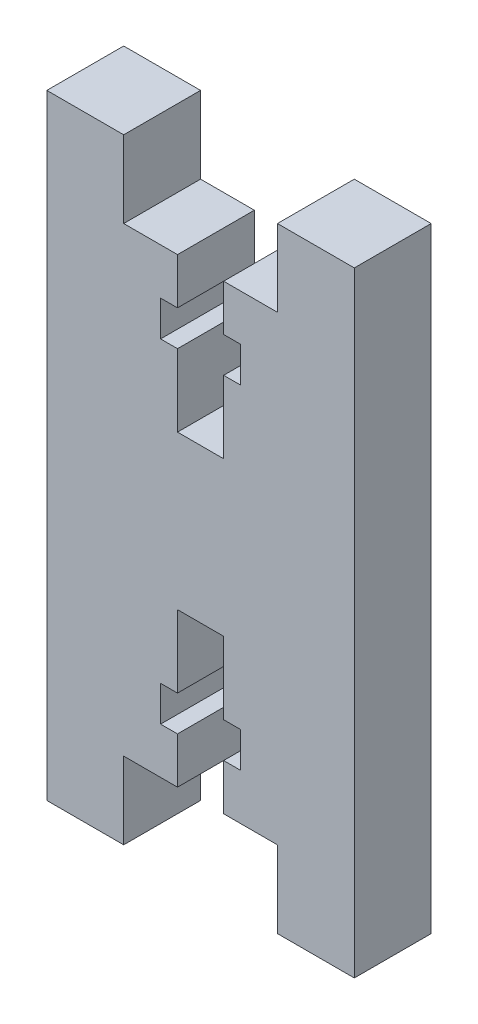
ISO-10303-21;
HEADER;
FILE_DESCRIPTION(('STEP AP214'),'2;1');
FILE_NAME('part.step','',(''),(''),'','','');
FILE_SCHEMA(('AUTOMOTIVE_DESIGN { 1 0 10303 214 1 1 1 1 }'));
ENDSEC;
DATA;
#1=APPLICATION_CONTEXT('core data for automotive mechanical design processes');
#2=APPLICATION_PROTOCOL_DEFINITION('international standard','automotive_design',2000,#1);
#3=PRODUCT_CONTEXT('',#1,'mechanical');
#4=PRODUCT('Part','Part','',(#3));
#5=PRODUCT_RELATED_PRODUCT_CATEGORY('part','',(#4));
#6=PRODUCT_DEFINITION_FORMATION('','',#4);
#7=PRODUCT_DEFINITION_CONTEXT('part definition',#1,'design');
#8=PRODUCT_DEFINITION('design','',#6,#7);
#9=PRODUCT_DEFINITION_SHAPE('','',#8);
#10=(LENGTH_UNIT() NAMED_UNIT(*) SI_UNIT(.MILLI.,.METRE.));
#11=(NAMED_UNIT(*) PLANE_ANGLE_UNIT() SI_UNIT($,.RADIAN.));
#12=(NAMED_UNIT(*) SI_UNIT($,.STERADIAN.) SOLID_ANGLE_UNIT());
#13=UNCERTAINTY_MEASURE_WITH_UNIT(LENGTH_MEASURE(1.E-05),#10,'distance_accuracy_value','');
#14=(GEOMETRIC_REPRESENTATION_CONTEXT(3) GLOBAL_UNCERTAINTY_ASSIGNED_CONTEXT((#13)) GLOBAL_UNIT_ASSIGNED_CONTEXT((#10,
#11,#12)) REPRESENTATION_CONTEXT('',''));
#15=CARTESIAN_POINT('',(0.,0.,0.));
#16=DIRECTION('',(0.,0.,1.));
#17=DIRECTION('',(1.,0.,0.));
#18=AXIS2_PLACEMENT_3D('',#15,#16,#17);
#19=CARTESIAN_POINT('',(0.,-5.,5.));
#20=DIRECTION('',(1.,0.,0.));
#21=DIRECTION('',(0.,0.,-1.));
#22=AXIS2_PLACEMENT_3D('',#19,#20,#21);
#23=PLANE('',#22);
#24=DIRECTION('',(0.,-1.,0.));
#25=VECTOR('',#24,1.);
#26=CARTESIAN_POINT('',(0.,-5.,0.));
#27=LINE('',#26,#25);
#28=CARTESIAN_POINT('',(0.,35.,0.));
#29=VERTEX_POINT('',#28);
#30=CARTESIAN_POINT('',(0.,-5.,0.));
#31=VERTEX_POINT('',#30);
#32=EDGE_CURVE('E168',#29,#31,#27,.T.);
#33=ORIENTED_EDGE('',*,*,#32,.T.);
#34=DIRECTION('',(0.,0.,-1.));
#35=VECTOR('',#34,1.);
#36=CARTESIAN_POINT('',(0.,-5.,5.));
#37=LINE('',#36,#35);
#38=CARTESIAN_POINT('',(0.,-5.,5.));
#39=VERTEX_POINT('',#38);
#40=EDGE_CURVE('E11',#39,#31,#37,.T.);
#41=ORIENTED_EDGE('',*,*,#40,.F.);
#42=DIRECTION('',(0.,-1.,0.));
#43=VECTOR('',#42,1.);
#44=CARTESIAN_POINT('',(0.,35.,5.));
#45=LINE('',#44,#43);
#46=CARTESIAN_POINT('',(0.,35.,5.));
#47=VERTEX_POINT('',#46);
#48=EDGE_CURVE('E174',#47,#39,#45,.T.);
#49=ORIENTED_EDGE('',*,*,#48,.F.);
#50=DIRECTION('',(0.,0.,-1.));
#51=VECTOR('',#50,1.);
#52=CARTESIAN_POINT('',(0.,35.,5.));
#53=LINE('',#52,#51);
#54=EDGE_CURVE('E292',#47,#29,#53,.T.);
#55=ORIENTED_EDGE('',*,*,#54,.T.);
#56=EDGE_LOOP('',(#33,#41,#49,#55));
#57=FACE_BOUND('',#56,.T.);
#58=ADVANCED_FACE('F32',(#57),#23,.F.);
#59=CARTESIAN_POINT('',(5.,-5.,5.));
#60=DIRECTION('',(0.,1.,0.));
#61=DIRECTION('',(0.,0.,1.));
#62=AXIS2_PLACEMENT_3D('',#59,#60,#61);
#63=PLANE('',#62);
#64=DIRECTION('',(1.,0.,0.));
#65=VECTOR('',#64,1.);
#66=CARTESIAN_POINT('',(5.,-5.,0.));
#67=LINE('',#66,#65);
#68=CARTESIAN_POINT('',(5.,-5.,0.));
#69=VERTEX_POINT('',#68);
#70=EDGE_CURVE('E297',#31,#69,#67,.T.);
#71=ORIENTED_EDGE('',*,*,#70,.T.);
#72=DIRECTION('',(0.,0.,-1.));
#73=VECTOR('',#72,1.);
#74=CARTESIAN_POINT('',(5.,-5.,5.));
#75=LINE('',#74,#73);
#76=CARTESIAN_POINT('',(5.,-5.,5.));
#77=VERTEX_POINT('',#76);
#78=EDGE_CURVE('E40',#77,#69,#75,.T.);
#79=ORIENTED_EDGE('',*,*,#78,.F.);
#80=DIRECTION('',(1.,0.,0.));
#81=VECTOR('',#80,1.);
#82=CARTESIAN_POINT('',(5.,-5.,5.));
#83=LINE('',#82,#81);
#84=EDGE_CURVE('E554',#39,#77,#83,.T.);
#85=ORIENTED_EDGE('',*,*,#84,.F.);
#86=ORIENTED_EDGE('',*,*,#40,.T.);
#87=EDGE_LOOP('',(#71,#79,#85,#86));
#88=FACE_BOUND('',#87,.T.);
#89=ADVANCED_FACE('F557',(#88),#63,.F.);
#90=CARTESIAN_POINT('',(5.,-5.,5.));
#91=DIRECTION('',(-1.,0.,0.));
#92=DIRECTION('',(0.,0.,1.));
#93=AXIS2_PLACEMENT_3D('',#90,#91,#92);
#94=PLANE('',#93);
#95=DIRECTION('',(0.,1.,0.));
#96=VECTOR('',#95,1.);
#97=CARTESIAN_POINT('',(5.,-5.,0.));
#98=LINE('',#97,#96);
#99=CARTESIAN_POINT('',(5.,0.,0.));
#100=VERTEX_POINT('',#99);
#101=EDGE_CURVE('E299',#69,#100,#98,.T.);
#102=ORIENTED_EDGE('',*,*,#101,.T.);
#103=DIRECTION('',(0.,0.,-1.));
#104=VECTOR('',#103,1.);
#105=CARTESIAN_POINT('',(5.,0.,5.));
#106=LINE('',#105,#104);
#107=CARTESIAN_POINT('',(5.,0.,5.));
#108=VERTEX_POINT('',#107);
#109=EDGE_CURVE('E457',#108,#100,#106,.T.);
#110=ORIENTED_EDGE('',*,*,#109,.F.);
#111=DIRECTION('',(0.,1.,0.));
#112=VECTOR('',#111,1.);
#113=CARTESIAN_POINT('',(5.,-5.,5.));
#114=LINE('',#113,#112);
#115=EDGE_CURVE('E466',#77,#108,#114,.T.);
#116=ORIENTED_EDGE('',*,*,#115,.F.);
#117=ORIENTED_EDGE('',*,*,#78,.T.);
#118=EDGE_LOOP('',(#102,#110,#116,#117));
#119=FACE_BOUND('',#118,.T.);
#120=ADVANCED_FACE('F464',(#119),#94,.F.);
#121=CARTESIAN_POINT('',(8.5,0.,5.));
#122=DIRECTION('',(0.,1.,0.));
#123=DIRECTION('',(-1.,0.,0.));
#124=AXIS2_PLACEMENT_3D('',#121,#122,#123);
#125=PLANE('',#124);
#126=DIRECTION('',(1.,0.,0.));
#127=VECTOR('',#126,1.);
#128=CARTESIAN_POINT('',(8.5,0.,0.));
#129=LINE('',#128,#127);
#130=CARTESIAN_POINT('',(8.5,0.,0.));
#131=VERTEX_POINT('',#130);
#132=EDGE_CURVE('E301',#100,#131,#129,.T.);
#133=ORIENTED_EDGE('',*,*,#132,.T.);
#134=DIRECTION('',(0.,0.,-1.));
#135=VECTOR('',#134,1.);
#136=CARTESIAN_POINT('',(8.5,0.,5.));
#137=LINE('',#136,#135);
#138=CARTESIAN_POINT('',(8.5,0.,5.));
#139=VERTEX_POINT('',#138);
#140=EDGE_CURVE('E454',#139,#131,#137,.T.);
#141=ORIENTED_EDGE('',*,*,#140,.F.);
#142=DIRECTION('',(1.,0.,0.));
#143=VECTOR('',#142,1.);
#144=CARTESIAN_POINT('',(8.5,0.,5.));
#145=LINE('',#144,#143);
#146=EDGE_CURVE('E484',#108,#139,#145,.T.);
#147=ORIENTED_EDGE('',*,*,#146,.F.);
#148=ORIENTED_EDGE('',*,*,#109,.T.);
#149=EDGE_LOOP('',(#133,#141,#147,#148));
#150=FACE_BOUND('',#149,.T.);
#151=ADVANCED_FACE('F475',(#150),#125,.F.);
#152=CARTESIAN_POINT('',(8.5,3.,5.));
#153=DIRECTION('',(-1.,0.,0.));
#154=DIRECTION('',(0.,0.,1.));
#155=AXIS2_PLACEMENT_3D('',#152,#153,#154);
#156=PLANE('',#155);
#157=DIRECTION('',(0.,1.,0.));
#158=VECTOR('',#157,1.);
#159=CARTESIAN_POINT('',(8.5,3.,0.));
#160=LINE('',#159,#158);
#161=CARTESIAN_POINT('',(8.5,3.,0.));
#162=VERTEX_POINT('',#161);
#163=EDGE_CURVE('E303',#131,#162,#160,.T.);
#164=ORIENTED_EDGE('',*,*,#163,.T.);
#165=DIRECTION('',(0.,0.,-1.));
#166=VECTOR('',#165,1.);
#167=CARTESIAN_POINT('',(8.5,3.,5.));
#168=LINE('',#167,#166);
#169=CARTESIAN_POINT('',(8.5,3.,5.));
#170=VERTEX_POINT('',#169);
#171=EDGE_CURVE('E451',#170,#162,#168,.T.);
#172=ORIENTED_EDGE('',*,*,#171,.F.);
#173=DIRECTION('',(0.,1.,0.));
#174=VECTOR('',#173,1.);
#175=CARTESIAN_POINT('',(8.5,3.,5.));
#176=LINE('',#175,#174);
#177=EDGE_CURVE('E481',#139,#170,#176,.T.);
#178=ORIENTED_EDGE('',*,*,#177,.F.);
#179=ORIENTED_EDGE('',*,*,#140,.T.);
#180=EDGE_LOOP('',(#164,#172,#178,#179));
#181=FACE_BOUND('',#180,.T.);
#182=ADVANCED_FACE('F479',(#181),#156,.F.);
#183=CARTESIAN_POINT('',(8.5,3.,5.));
#184=DIRECTION('',(0.,-1.,0.));
#185=DIRECTION('',(1.,0.,0.));
#186=AXIS2_PLACEMENT_3D('',#183,#184,#185);
#187=PLANE('',#186);
#188=DIRECTION('',(-1.,0.,0.));
#189=VECTOR('',#188,1.);
#190=CARTESIAN_POINT('',(8.5,3.,0.));
#191=LINE('',#190,#189);
#192=CARTESIAN_POINT('',(7.4,3.,0.));
#193=VERTEX_POINT('',#192);
#194=EDGE_CURVE('E305',#162,#193,#191,.T.);
#195=ORIENTED_EDGE('',*,*,#194,.T.);
#196=DIRECTION('',(0.,0.,-1.));
#197=VECTOR('',#196,1.);
#198=CARTESIAN_POINT('',(7.4,3.,5.));
#199=LINE('',#198,#197);
#200=CARTESIAN_POINT('',(7.4,3.,5.));
#201=VERTEX_POINT('',#200);
#202=EDGE_CURVE('E448',#201,#193,#199,.T.);
#203=ORIENTED_EDGE('',*,*,#202,.F.);
#204=DIRECTION('',(-1.,0.,0.));
#205=VECTOR('',#204,1.);
#206=CARTESIAN_POINT('',(8.5,3.,5.));
#207=LINE('',#206,#205);
#208=EDGE_CURVE('E483',#170,#201,#207,.T.);
#209=ORIENTED_EDGE('',*,*,#208,.F.);
#210=ORIENTED_EDGE('',*,*,#171,.T.);
#211=EDGE_LOOP('',(#195,#203,#209,#210));
#212=FACE_BOUND('',#211,.T.);
#213=ADVANCED_FACE('F569',(#212),#187,.F.);
#214=CARTESIAN_POINT('',(7.4,3.,5.));
#215=DIRECTION('',(-1.,0.,0.));
#216=DIRECTION('',(0.,-1.,0.));
#217=AXIS2_PLACEMENT_3D('',#214,#215,#216);
#218=PLANE('',#217);
#219=DIRECTION('',(0.,1.,0.));
#220=VECTOR('',#219,1.);
#221=CARTESIAN_POINT('',(7.4,3.,0.));
#222=LINE('',#221,#220);
#223=CARTESIAN_POINT('',(7.4,5.3,0.));
#224=VERTEX_POINT('',#223);
#225=EDGE_CURVE('E307',#193,#224,#222,.T.);
#226=ORIENTED_EDGE('',*,*,#225,.T.);
#227=DIRECTION('',(0.,0.,-1.));
#228=VECTOR('',#227,1.);
#229=CARTESIAN_POINT('',(7.4,5.3,5.));
#230=LINE('',#229,#228);
#231=CARTESIAN_POINT('',(7.4,5.3,5.));
#232=VERTEX_POINT('',#231);
#233=EDGE_CURVE('E445',#232,#224,#230,.T.);
#234=ORIENTED_EDGE('',*,*,#233,.F.);
#235=DIRECTION('',(0.,1.,0.));
#236=VECTOR('',#235,1.);
#237=CARTESIAN_POINT('',(7.4,3.,5.));
#238=LINE('',#237,#236);
#239=EDGE_CURVE('E486',#201,#232,#238,.T.);
#240=ORIENTED_EDGE('',*,*,#239,.F.);
#241=ORIENTED_EDGE('',*,*,#202,.T.);
#242=EDGE_LOOP('',(#226,#234,#240,#241));
#243=FACE_BOUND('',#242,.T.);
#244=ADVANCED_FACE('F572',(#243),#218,.F.);
#245=CARTESIAN_POINT('',(7.4,5.3,5.));
#246=DIRECTION('',(0.,1.,0.));
#247=DIRECTION('',(0.,0.,1.));
#248=AXIS2_PLACEMENT_3D('',#245,#246,#247);
#249=PLANE('',#248);
#250=DIRECTION('',(1.,0.,0.));
#251=VECTOR('',#250,1.);
#252=CARTESIAN_POINT('',(7.4,5.3,0.));
#253=LINE('',#252,#251);
#254=CARTESIAN_POINT('',(8.5,5.3,0.));
#255=VERTEX_POINT('',#254);
#256=EDGE_CURVE('E309',#224,#255,#253,.T.);
#257=ORIENTED_EDGE('',*,*,#256,.T.);
#258=DIRECTION('',(0.,0.,-1.));
#259=VECTOR('',#258,1.);
#260=CARTESIAN_POINT('',(8.5,5.3,5.));
#261=LINE('',#260,#259);
#262=CARTESIAN_POINT('',(8.5,5.3,5.));
#263=VERTEX_POINT('',#262);
#264=EDGE_CURVE('E442',#263,#255,#261,.T.);
#265=ORIENTED_EDGE('',*,*,#264,.F.);
#266=DIRECTION('',(1.,0.,0.));
#267=VECTOR('',#266,1.);
#268=CARTESIAN_POINT('',(7.4,5.3,5.));
#269=LINE('',#268,#267);
#270=EDGE_CURVE('E492',#232,#263,#269,.T.);
#271=ORIENTED_EDGE('',*,*,#270,.F.);
#272=ORIENTED_EDGE('',*,*,#233,.T.);
#273=EDGE_LOOP('',(#257,#265,#271,#272));
#274=FACE_BOUND('',#273,.T.);
#275=ADVANCED_FACE('F576',(#274),#249,.F.);
#276=CARTESIAN_POINT('',(8.5,10.,5.));
#277=DIRECTION('',(-1.,0.,0.));
#278=DIRECTION('',(0.,0.,1.));
#279=AXIS2_PLACEMENT_3D('',#276,#277,#278);
#280=PLANE('',#279);
#281=DIRECTION('',(0.,1.,0.));
#282=VECTOR('',#281,1.);
#283=CARTESIAN_POINT('',(8.5,10.,0.));
#284=LINE('',#283,#282);
#285=CARTESIAN_POINT('',(8.5,10.,0.));
#286=VERTEX_POINT('',#285);
#287=EDGE_CURVE('E311',#255,#286,#284,.T.);
#288=ORIENTED_EDGE('',*,*,#287,.T.);
#289=DIRECTION('',(0.,0.,-1.));
#290=VECTOR('',#289,1.);
#291=CARTESIAN_POINT('',(8.5,10.,5.));
#292=LINE('',#291,#290);
#293=CARTESIAN_POINT('',(8.5,10.,5.));
#294=VERTEX_POINT('',#293);
#295=EDGE_CURVE('E439',#294,#286,#292,.T.);
#296=ORIENTED_EDGE('',*,*,#295,.F.);
#297=DIRECTION('',(0.,1.,0.));
#298=VECTOR('',#297,1.);
#299=CARTESIAN_POINT('',(8.5,10.,5.));
#300=LINE('',#299,#298);
#301=EDGE_CURVE('E494',#263,#294,#300,.T.);
#302=ORIENTED_EDGE('',*,*,#301,.F.);
#303=ORIENTED_EDGE('',*,*,#264,.T.);
#304=EDGE_LOOP('',(#288,#296,#302,#303));
#305=FACE_BOUND('',#304,.T.);
#306=ADVANCED_FACE('F580',(#305),#280,.F.);
#307=CARTESIAN_POINT('',(11.5,10.,5.));
#308=DIRECTION('',(0.,1.,0.));
#309=DIRECTION('',(0.,0.,1.));
#310=AXIS2_PLACEMENT_3D('',#307,#308,#309);
#311=PLANE('',#310);
#312=DIRECTION('',(1.,0.,0.));
#313=VECTOR('',#312,1.);
#314=CARTESIAN_POINT('',(11.5,10.,0.));
#315=LINE('',#314,#313);
#316=CARTESIAN_POINT('',(11.5,10.,0.));
#317=VERTEX_POINT('',#316);
#318=EDGE_CURVE('E313',#286,#317,#315,.T.);
#319=ORIENTED_EDGE('',*,*,#318,.T.);
#320=DIRECTION('',(0.,0.,-1.));
#321=VECTOR('',#320,1.);
#322=CARTESIAN_POINT('',(11.5,10.,5.));
#323=LINE('',#322,#321);
#324=CARTESIAN_POINT('',(11.5,10.,5.));
#325=VERTEX_POINT('',#324);
#326=EDGE_CURVE('E436',#325,#317,#323,.T.);
#327=ORIENTED_EDGE('',*,*,#326,.F.);
#328=DIRECTION('',(1.,0.,0.));
#329=VECTOR('',#328,1.);
#330=CARTESIAN_POINT('',(11.5,10.,5.));
#331=LINE('',#330,#329);
#332=EDGE_CURVE('E496',#294,#325,#331,.T.);
#333=ORIENTED_EDGE('',*,*,#332,.F.);
#334=ORIENTED_EDGE('',*,*,#295,.T.);
#335=EDGE_LOOP('',(#319,#327,#333,#334));
#336=FACE_BOUND('',#335,.T.);
#337=ADVANCED_FACE('F584',(#336),#311,.F.);
#338=CARTESIAN_POINT('',(11.5,5.3,5.));
#339=DIRECTION('',(1.,0.,0.));
#340=DIRECTION('',(0.,0.,-1.));
#341=AXIS2_PLACEMENT_3D('',#338,#339,#340);
#342=PLANE('',#341);
#343=DIRECTION('',(0.,-1.,0.));
#344=VECTOR('',#343,1.);
#345=CARTESIAN_POINT('',(11.5,5.3,0.));
#346=LINE('',#345,#344);
#347=CARTESIAN_POINT('',(11.5,5.3,0.));
#348=VERTEX_POINT('',#347);
#349=EDGE_CURVE('E315',#317,#348,#346,.T.);
#350=ORIENTED_EDGE('',*,*,#349,.T.);
#351=DIRECTION('',(0.,0.,-1.));
#352=VECTOR('',#351,1.);
#353=CARTESIAN_POINT('',(11.5,5.3,5.));
#354=LINE('',#353,#352);
#355=CARTESIAN_POINT('',(11.5,5.3,5.));
#356=VERTEX_POINT('',#355);
#357=EDGE_CURVE('E433',#356,#348,#354,.T.);
#358=ORIENTED_EDGE('',*,*,#357,.F.);
#359=DIRECTION('',(0.,-1.,0.));
#360=VECTOR('',#359,1.);
#361=CARTESIAN_POINT('',(11.5,5.3,5.));
#362=LINE('',#361,#360);
#363=EDGE_CURVE('E498',#325,#356,#362,.T.);
#364=ORIENTED_EDGE('',*,*,#363,.F.);
#365=ORIENTED_EDGE('',*,*,#326,.T.);
#366=EDGE_LOOP('',(#350,#358,#364,#365));
#367=FACE_BOUND('',#366,.T.);
#368=ADVANCED_FACE('F588',(#367),#342,.F.);
#369=CARTESIAN_POINT('',(11.5,5.3,5.));
#370=DIRECTION('',(0.,1.,0.));
#371=DIRECTION('',(0.,0.,1.));
#372=AXIS2_PLACEMENT_3D('',#369,#370,#371);
#373=PLANE('',#372);
#374=DIRECTION('',(1.,0.,0.));
#375=VECTOR('',#374,1.);
#376=CARTESIAN_POINT('',(11.5,5.3,0.));
#377=LINE('',#376,#375);
#378=CARTESIAN_POINT('',(12.6,5.3,0.));
#379=VERTEX_POINT('',#378);
#380=EDGE_CURVE('E317',#348,#379,#377,.T.);
#381=ORIENTED_EDGE('',*,*,#380,.T.);
#382=DIRECTION('',(0.,0.,-1.));
#383=VECTOR('',#382,1.);
#384=CARTESIAN_POINT('',(12.6,5.3,5.));
#385=LINE('',#384,#383);
#386=CARTESIAN_POINT('',(12.6,5.3,5.));
#387=VERTEX_POINT('',#386);
#388=EDGE_CURVE('E430',#387,#379,#385,.T.);
#389=ORIENTED_EDGE('',*,*,#388,.F.);
#390=DIRECTION('',(1.,0.,0.));
#391=VECTOR('',#390,1.);
#392=CARTESIAN_POINT('',(11.5,5.3,5.));
#393=LINE('',#392,#391);
#394=EDGE_CURVE('E500',#356,#387,#393,.T.);
#395=ORIENTED_EDGE('',*,*,#394,.F.);
#396=ORIENTED_EDGE('',*,*,#357,.T.);
#397=EDGE_LOOP('',(#381,#389,#395,#396));
#398=FACE_BOUND('',#397,.T.);
#399=ADVANCED_FACE('F592',(#398),#373,.F.);
#400=CARTESIAN_POINT('',(12.6,5.3,5.));
#401=DIRECTION('',(1.,0.,0.));
#402=DIRECTION('',(0.,1.,0.));
#403=AXIS2_PLACEMENT_3D('',#400,#401,#402);
#404=PLANE('',#403);
#405=DIRECTION('',(0.,-1.,0.));
#406=VECTOR('',#405,1.);
#407=CARTESIAN_POINT('',(12.6,5.3,0.));
#408=LINE('',#407,#406);
#409=CARTESIAN_POINT('',(12.6,3.,0.));
#410=VERTEX_POINT('',#409);
#411=EDGE_CURVE('E319',#379,#410,#408,.T.);
#412=ORIENTED_EDGE('',*,*,#411,.T.);
#413=DIRECTION('',(0.,0.,-1.));
#414=VECTOR('',#413,1.);
#415=CARTESIAN_POINT('',(12.6,3.,5.));
#416=LINE('',#415,#414);
#417=CARTESIAN_POINT('',(12.6,3.,5.));
#418=VERTEX_POINT('',#417);
#419=EDGE_CURVE('E427',#418,#410,#416,.T.);
#420=ORIENTED_EDGE('',*,*,#419,.F.);
#421=DIRECTION('',(0.,-1.,0.));
#422=VECTOR('',#421,1.);
#423=CARTESIAN_POINT('',(12.6,5.3,5.));
#424=LINE('',#423,#422);
#425=EDGE_CURVE('E502',#387,#418,#424,.T.);
#426=ORIENTED_EDGE('',*,*,#425,.F.);
#427=ORIENTED_EDGE('',*,*,#388,.T.);
#428=EDGE_LOOP('',(#412,#420,#426,#427));
#429=FACE_BOUND('',#428,.T.);
#430=ADVANCED_FACE('F596',(#429),#404,.F.);
#431=CARTESIAN_POINT('',(12.6,3.,5.));
#432=DIRECTION('',(0.,-1.,0.));
#433=DIRECTION('',(1.,0.,0.));
#434=AXIS2_PLACEMENT_3D('',#431,#432,#433);
#435=PLANE('',#434);
#436=DIRECTION('',(-1.,0.,0.));
#437=VECTOR('',#436,1.);
#438=CARTESIAN_POINT('',(12.6,3.,0.));
#439=LINE('',#438,#437);
#440=CARTESIAN_POINT('',(11.5,3.,0.));
#441=VERTEX_POINT('',#440);
#442=EDGE_CURVE('E321',#410,#441,#439,.T.);
#443=ORIENTED_EDGE('',*,*,#442,.T.);
#444=DIRECTION('',(0.,0.,-1.));
#445=VECTOR('',#444,1.);
#446=CARTESIAN_POINT('',(11.5,3.,5.));
#447=LINE('',#446,#445);
#448=CARTESIAN_POINT('',(11.5,3.,5.));
#449=VERTEX_POINT('',#448);
#450=EDGE_CURVE('E424',#449,#441,#447,.T.);
#451=ORIENTED_EDGE('',*,*,#450,.F.);
#452=DIRECTION('',(-1.,0.,0.));
#453=VECTOR('',#452,1.);
#454=CARTESIAN_POINT('',(12.6,3.,5.));
#455=LINE('',#454,#453);
#456=EDGE_CURVE('E504',#418,#449,#455,.T.);
#457=ORIENTED_EDGE('',*,*,#456,.F.);
#458=ORIENTED_EDGE('',*,*,#419,.T.);
#459=EDGE_LOOP('',(#443,#451,#457,#458));
#460=FACE_BOUND('',#459,.T.);
#461=ADVANCED_FACE('F600',(#460),#435,.F.);
#462=CARTESIAN_POINT('',(11.5,0.,5.));
#463=DIRECTION('',(1.,0.,0.));
#464=DIRECTION('',(0.,0.,-1.));
#465=AXIS2_PLACEMENT_3D('',#462,#463,#464);
#466=PLANE('',#465);
#467=DIRECTION('',(0.,-1.,0.));
#468=VECTOR('',#467,1.);
#469=CARTESIAN_POINT('',(11.5,0.,0.));
#470=LINE('',#469,#468);
#471=CARTESIAN_POINT('',(11.5,0.,0.));
#472=VERTEX_POINT('',#471);
#473=EDGE_CURVE('E323',#441,#472,#470,.T.);
#474=ORIENTED_EDGE('',*,*,#473,.T.);
#475=DIRECTION('',(0.,0.,-1.));
#476=VECTOR('',#475,1.);
#477=CARTESIAN_POINT('',(11.5,0.,5.));
#478=LINE('',#477,#476);
#479=CARTESIAN_POINT('',(11.5,0.,5.));
#480=VERTEX_POINT('',#479);
#481=EDGE_CURVE('E421',#480,#472,#478,.T.);
#482=ORIENTED_EDGE('',*,*,#481,.F.);
#483=DIRECTION('',(0.,-1.,0.));
#484=VECTOR('',#483,1.);
#485=CARTESIAN_POINT('',(11.5,0.,5.));
#486=LINE('',#485,#484);
#487=EDGE_CURVE('E506',#449,#480,#486,.T.);
#488=ORIENTED_EDGE('',*,*,#487,.F.);
#489=ORIENTED_EDGE('',*,*,#450,.T.);
#490=EDGE_LOOP('',(#474,#482,#488,#489));
#491=FACE_BOUND('',#490,.T.);
#492=ADVANCED_FACE('F604',(#491),#466,.F.);
#493=CARTESIAN_POINT('',(11.5,0.,5.));
#494=DIRECTION('',(0.,1.,0.));
#495=DIRECTION('',(-1.,0.,0.));
#496=AXIS2_PLACEMENT_3D('',#493,#494,#495);
#497=PLANE('',#496);
#498=DIRECTION('',(1.,0.,0.));
#499=VECTOR('',#498,1.);
#500=CARTESIAN_POINT('',(11.5,0.,0.));
#501=LINE('',#500,#499);
#502=CARTESIAN_POINT('',(15.,0.,0.));
#503=VERTEX_POINT('',#502);
#504=EDGE_CURVE('E325',#472,#503,#501,.T.);
#505=ORIENTED_EDGE('',*,*,#504,.T.);
#506=DIRECTION('',(0.,0.,-1.));
#507=VECTOR('',#506,1.);
#508=CARTESIAN_POINT('',(15.,0.,5.));
#509=LINE('',#508,#507);
#510=CARTESIAN_POINT('',(15.,0.,5.));
#511=VERTEX_POINT('',#510);
#512=EDGE_CURVE('E418',#511,#503,#509,.T.);
#513=ORIENTED_EDGE('',*,*,#512,.F.);
#514=DIRECTION('',(1.,0.,0.));
#515=VECTOR('',#514,1.);
#516=CARTESIAN_POINT('',(11.5,0.,5.));
#517=LINE('',#516,#515);
#518=EDGE_CURVE('E508',#480,#511,#517,.T.);
#519=ORIENTED_EDGE('',*,*,#518,.F.);
#520=ORIENTED_EDGE('',*,*,#481,.T.);
#521=EDGE_LOOP('',(#505,#513,#519,#520));
#522=FACE_BOUND('',#521,.T.);
#523=ADVANCED_FACE('F608',(#522),#497,.F.);
#524=CARTESIAN_POINT('',(15.,0.,5.));
#525=DIRECTION('',(1.,0.,0.));
#526=DIRECTION('',(0.,0.,-1.));
#527=AXIS2_PLACEMENT_3D('',#524,#525,#526);
#528=PLANE('',#527);
#529=DIRECTION('',(0.,-1.,0.));
#530=VECTOR('',#529,1.);
#531=CARTESIAN_POINT('',(15.,0.,0.));
#532=LINE('',#531,#530);
#533=CARTESIAN_POINT('',(15.,-5.,0.));
#534=VERTEX_POINT('',#533);
#535=EDGE_CURVE('E327',#503,#534,#532,.T.);
#536=ORIENTED_EDGE('',*,*,#535,.T.);
#537=DIRECTION('',(0.,0.,-1.));
#538=VECTOR('',#537,1.);
#539=CARTESIAN_POINT('',(15.,-5.,5.));
#540=LINE('',#539,#538);
#541=CARTESIAN_POINT('',(15.,-5.,5.));
#542=VERTEX_POINT('',#541);
#543=EDGE_CURVE('E415',#542,#534,#540,.T.);
#544=ORIENTED_EDGE('',*,*,#543,.F.);
#545=DIRECTION('',(0.,-1.,0.));
#546=VECTOR('',#545,1.);
#547=CARTESIAN_POINT('',(15.,0.,5.));
#548=LINE('',#547,#546);
#549=EDGE_CURVE('E510',#511,#542,#548,.T.);
#550=ORIENTED_EDGE('',*,*,#549,.F.);
#551=ORIENTED_EDGE('',*,*,#512,.T.);
#552=EDGE_LOOP('',(#536,#544,#550,#551));
#553=FACE_BOUND('',#552,.T.);
#554=ADVANCED_FACE('F612',(#553),#528,.F.);
#555=CARTESIAN_POINT('',(15.,-5.,5.));
#556=DIRECTION('',(0.,1.,0.));
#557=DIRECTION('',(0.,0.,1.));
#558=AXIS2_PLACEMENT_3D('',#555,#556,#557);
#559=PLANE('',#558);
#560=DIRECTION('',(1.,0.,0.));
#561=VECTOR('',#560,1.);
#562=CARTESIAN_POINT('',(15.,-5.,0.));
#563=LINE('',#562,#561);
#564=CARTESIAN_POINT('',(20.,-5.,0.));
#565=VERTEX_POINT('',#564);
#566=EDGE_CURVE('E329',#534,#565,#563,.T.);
#567=ORIENTED_EDGE('',*,*,#566,.T.);
#568=DIRECTION('',(0.,0.,-1.));
#569=VECTOR('',#568,1.);
#570=CARTESIAN_POINT('',(20.,-5.,5.));
#571=LINE('',#570,#569);
#572=CARTESIAN_POINT('',(20.,-5.,5.));
#573=VERTEX_POINT('',#572);
#574=EDGE_CURVE('E412',#573,#565,#571,.T.);
#575=ORIENTED_EDGE('',*,*,#574,.F.);
#576=DIRECTION('',(1.,0.,0.));
#577=VECTOR('',#576,1.);
#578=CARTESIAN_POINT('',(15.,-5.,5.));
#579=LINE('',#578,#577);
#580=EDGE_CURVE('E512',#542,#573,#579,.T.);
#581=ORIENTED_EDGE('',*,*,#580,.F.);
#582=ORIENTED_EDGE('',*,*,#543,.T.);
#583=EDGE_LOOP('',(#567,#575,#581,#582));
#584=FACE_BOUND('',#583,.T.);
#585=ADVANCED_FACE('F616',(#584),#559,.F.);
#586=CARTESIAN_POINT('',(20.,0.,5.));
#587=DIRECTION('',(-1.,0.,0.));
#588=DIRECTION('',(0.,0.,1.));
#589=AXIS2_PLACEMENT_3D('',#586,#587,#588);
#590=PLANE('',#589);
#591=DIRECTION('',(0.,1.,0.));
#592=VECTOR('',#591,1.);
#593=CARTESIAN_POINT('',(20.,0.,0.));
#594=LINE('',#593,#592);
#595=CARTESIAN_POINT('',(20.,35.,0.));
#596=VERTEX_POINT('',#595);
#597=EDGE_CURVE('E332',#565,#596,#594,.T.);
#598=ORIENTED_EDGE('',*,*,#597,.T.);
#599=DIRECTION('',(0.,0.,-1.));
#600=VECTOR('',#599,1.);
#601=CARTESIAN_POINT('',(20.,35.,5.));
#602=LINE('',#601,#600);
#603=CARTESIAN_POINT('',(20.,35.,5.));
#604=VERTEX_POINT('',#603);
#605=EDGE_CURVE('E409',#604,#596,#602,.T.);
#606=ORIENTED_EDGE('',*,*,#605,.F.);
#607=DIRECTION('',(0.,1.,0.));
#608=VECTOR('',#607,1.);
#609=CARTESIAN_POINT('',(20.,-5.,5.));
#610=LINE('',#609,#608);
#611=EDGE_CURVE('E514',#573,#604,#610,.T.);
#612=ORIENTED_EDGE('',*,*,#611,.F.);
#613=ORIENTED_EDGE('',*,*,#574,.T.);
#614=EDGE_LOOP('',(#598,#606,#612,#613));
#615=FACE_BOUND('',#614,.T.);
#616=ADVANCED_FACE('F620',(#615),#590,.F.);
#617=CARTESIAN_POINT('',(15.,35.,5.));
#618=DIRECTION('',(0.,-1.,0.));
#619=DIRECTION('',(0.,0.,-1.));
#620=AXIS2_PLACEMENT_3D('',#617,#618,#619);
#621=PLANE('',#620);
#622=DIRECTION('',(-1.,0.,0.));
#623=VECTOR('',#622,1.);
#624=CARTESIAN_POINT('',(15.,35.,0.));
#625=LINE('',#624,#623);
#626=CARTESIAN_POINT('',(15.,35.,0.));
#627=VERTEX_POINT('',#626);
#628=EDGE_CURVE('E334',#596,#627,#625,.T.);
#629=ORIENTED_EDGE('',*,*,#628,.T.);
#630=DIRECTION('',(0.,0.,-1.));
#631=VECTOR('',#630,1.);
#632=CARTESIAN_POINT('',(15.,35.,5.));
#633=LINE('',#632,#631);
#634=CARTESIAN_POINT('',(15.,35.,5.));
#635=VERTEX_POINT('',#634);
#636=EDGE_CURVE('E406',#635,#627,#633,.T.);
#637=ORIENTED_EDGE('',*,*,#636,.F.);
#638=DIRECTION('',(-1.,0.,0.));
#639=VECTOR('',#638,1.);
#640=CARTESIAN_POINT('',(15.,35.,5.));
#641=LINE('',#640,#639);
#642=EDGE_CURVE('E516',#604,#635,#641,.T.);
#643=ORIENTED_EDGE('',*,*,#642,.F.);
#644=ORIENTED_EDGE('',*,*,#605,.T.);
#645=EDGE_LOOP('',(#629,#637,#643,#644));
#646=FACE_BOUND('',#645,.T.);
#647=ADVANCED_FACE('F624',(#646),#621,.F.);
#648=CARTESIAN_POINT('',(15.,35.,5.));
#649=DIRECTION('',(1.,0.,0.));
#650=DIRECTION('',(0.,0.,-1.));
#651=AXIS2_PLACEMENT_3D('',#648,#649,#650);
#652=PLANE('',#651);
#653=DIRECTION('',(0.,-1.,0.));
#654=VECTOR('',#653,1.);
#655=CARTESIAN_POINT('',(15.,35.,0.));
#656=LINE('',#655,#654);
#657=CARTESIAN_POINT('',(15.,30.,0.));
#658=VERTEX_POINT('',#657);
#659=EDGE_CURVE('E336',#627,#658,#656,.T.);
#660=ORIENTED_EDGE('',*,*,#659,.T.);
#661=DIRECTION('',(0.,0.,-1.));
#662=VECTOR('',#661,1.);
#663=CARTESIAN_POINT('',(15.,30.,5.));
#664=LINE('',#663,#662);
#665=CARTESIAN_POINT('',(15.,30.,5.));
#666=VERTEX_POINT('',#665);
#667=EDGE_CURVE('E403',#666,#658,#664,.T.);
#668=ORIENTED_EDGE('',*,*,#667,.F.);
#669=DIRECTION('',(0.,-1.,0.));
#670=VECTOR('',#669,1.);
#671=CARTESIAN_POINT('',(15.,35.,5.));
#672=LINE('',#671,#670);
#673=EDGE_CURVE('E518',#635,#666,#672,.T.);
#674=ORIENTED_EDGE('',*,*,#673,.F.);
#675=ORIENTED_EDGE('',*,*,#636,.T.);
#676=EDGE_LOOP('',(#660,#668,#674,#675));
#677=FACE_BOUND('',#676,.T.);
#678=ADVANCED_FACE('F628',(#677),#652,.F.);
#679=CARTESIAN_POINT('',(11.5,30.,5.));
#680=DIRECTION('',(0.,-1.,0.));
#681=DIRECTION('',(0.,0.,-1.));
#682=AXIS2_PLACEMENT_3D('',#679,#680,#681);
#683=PLANE('',#682);
#684=DIRECTION('',(-1.,0.,0.));
#685=VECTOR('',#684,1.);
#686=CARTESIAN_POINT('',(11.5,30.,0.));
#687=LINE('',#686,#685);
#688=CARTESIAN_POINT('',(11.5,30.,0.));
#689=VERTEX_POINT('',#688);
#690=EDGE_CURVE('E338',#658,#689,#687,.T.);
#691=ORIENTED_EDGE('',*,*,#690,.T.);
#692=DIRECTION('',(0.,0.,-1.));
#693=VECTOR('',#692,1.);
#694=CARTESIAN_POINT('',(11.5,30.,5.));
#695=LINE('',#694,#693);
#696=CARTESIAN_POINT('',(11.5,30.,5.));
#697=VERTEX_POINT('',#696);
#698=EDGE_CURVE('E400',#697,#689,#695,.T.);
#699=ORIENTED_EDGE('',*,*,#698,.F.);
#700=DIRECTION('',(-1.,0.,0.));
#701=VECTOR('',#700,1.);
#702=CARTESIAN_POINT('',(11.5,30.,5.));
#703=LINE('',#702,#701);
#704=EDGE_CURVE('E520',#666,#697,#703,.T.);
#705=ORIENTED_EDGE('',*,*,#704,.F.);
#706=ORIENTED_EDGE('',*,*,#667,.T.);
#707=EDGE_LOOP('',(#691,#699,#705,#706));
#708=FACE_BOUND('',#707,.T.);
#709=ADVANCED_FACE('F632',(#708),#683,.F.);
#710=CARTESIAN_POINT('',(11.5,27.,5.));
#711=DIRECTION('',(1.,0.,0.));
#712=DIRECTION('',(0.,0.,-1.));
#713=AXIS2_PLACEMENT_3D('',#710,#711,#712);
#714=PLANE('',#713);
#715=DIRECTION('',(0.,-1.,0.));
#716=VECTOR('',#715,1.);
#717=CARTESIAN_POINT('',(11.5,27.,0.));
#718=LINE('',#717,#716);
#719=CARTESIAN_POINT('',(11.5,27.,0.));
#720=VERTEX_POINT('',#719);
#721=EDGE_CURVE('E340',#689,#720,#718,.T.);
#722=ORIENTED_EDGE('',*,*,#721,.T.);
#723=DIRECTION('',(0.,0.,-1.));
#724=VECTOR('',#723,1.);
#725=CARTESIAN_POINT('',(11.5,27.,5.));
#726=LINE('',#725,#724);
#727=CARTESIAN_POINT('',(11.5,27.,5.));
#728=VERTEX_POINT('',#727);
#729=EDGE_CURVE('E397',#728,#720,#726,.T.);
#730=ORIENTED_EDGE('',*,*,#729,.F.);
#731=DIRECTION('',(0.,-1.,0.));
#732=VECTOR('',#731,1.);
#733=CARTESIAN_POINT('',(11.5,27.,5.));
#734=LINE('',#733,#732);
#735=EDGE_CURVE('E522',#697,#728,#734,.T.);
#736=ORIENTED_EDGE('',*,*,#735,.F.);
#737=ORIENTED_EDGE('',*,*,#698,.T.);
#738=EDGE_LOOP('',(#722,#730,#736,#737));
#739=FACE_BOUND('',#738,.T.);
#740=ADVANCED_FACE('F636',(#739),#714,.F.);
#741=CARTESIAN_POINT('',(11.5,27.,5.));
#742=DIRECTION('',(0.,1.,0.));
#743=DIRECTION('',(0.,0.,1.));
#744=AXIS2_PLACEMENT_3D('',#741,#742,#743);
#745=PLANE('',#744);
#746=DIRECTION('',(1.,0.,0.));
#747=VECTOR('',#746,1.);
#748=CARTESIAN_POINT('',(11.5,27.,0.));
#749=LINE('',#748,#747);
#750=CARTESIAN_POINT('',(12.6,27.,0.));
#751=VERTEX_POINT('',#750);
#752=EDGE_CURVE('E342',#720,#751,#749,.T.);
#753=ORIENTED_EDGE('',*,*,#752,.T.);
#754=DIRECTION('',(0.,0.,-1.));
#755=VECTOR('',#754,1.);
#756=CARTESIAN_POINT('',(12.6,27.,5.));
#757=LINE('',#756,#755);
#758=CARTESIAN_POINT('',(12.6,27.,5.));
#759=VERTEX_POINT('',#758);
#760=EDGE_CURVE('E394',#759,#751,#757,.T.);
#761=ORIENTED_EDGE('',*,*,#760,.F.);
#762=DIRECTION('',(1.,0.,0.));
#763=VECTOR('',#762,1.);
#764=CARTESIAN_POINT('',(11.5,27.,5.));
#765=LINE('',#764,#763);
#766=EDGE_CURVE('E524',#728,#759,#765,.T.);
#767=ORIENTED_EDGE('',*,*,#766,.F.);
#768=ORIENTED_EDGE('',*,*,#729,.T.);
#769=EDGE_LOOP('',(#753,#761,#767,#768));
#770=FACE_BOUND('',#769,.T.);
#771=ADVANCED_FACE('F640',(#770),#745,.F.);
#772=CARTESIAN_POINT('',(12.6,27.,5.));
#773=DIRECTION('',(1.,0.,0.));
#774=DIRECTION('',(0.,0.,-1.));
#775=AXIS2_PLACEMENT_3D('',#772,#773,#774);
#776=PLANE('',#775);
#777=DIRECTION('',(0.,-1.,0.));
#778=VECTOR('',#777,1.);
#779=CARTESIAN_POINT('',(12.6,27.,0.));
#780=LINE('',#779,#778);
#781=CARTESIAN_POINT('',(12.6,24.7,0.));
#782=VERTEX_POINT('',#781);
#783=EDGE_CURVE('E344',#751,#782,#780,.T.);
#784=ORIENTED_EDGE('',*,*,#783,.T.);
#785=DIRECTION('',(0.,0.,-1.));
#786=VECTOR('',#785,1.);
#787=CARTESIAN_POINT('',(12.6,24.7,5.));
#788=LINE('',#787,#786);
#789=CARTESIAN_POINT('',(12.6,24.7,5.));
#790=VERTEX_POINT('',#789);
#791=EDGE_CURVE('E391',#790,#782,#788,.T.);
#792=ORIENTED_EDGE('',*,*,#791,.F.);
#793=DIRECTION('',(0.,-1.,0.));
#794=VECTOR('',#793,1.);
#795=CARTESIAN_POINT('',(12.6,27.,5.));
#796=LINE('',#795,#794);
#797=EDGE_CURVE('E526',#759,#790,#796,.T.);
#798=ORIENTED_EDGE('',*,*,#797,.F.);
#799=ORIENTED_EDGE('',*,*,#760,.T.);
#800=EDGE_LOOP('',(#784,#792,#798,#799));
#801=FACE_BOUND('',#800,.T.);
#802=ADVANCED_FACE('F644',(#801),#776,.F.);
#803=CARTESIAN_POINT('',(12.6,24.7,5.));
#804=DIRECTION('',(0.,-1.,0.));
#805=DIRECTION('',(0.,0.,-1.));
#806=AXIS2_PLACEMENT_3D('',#803,#804,#805);
#807=PLANE('',#806);
#808=DIRECTION('',(-1.,0.,0.));
#809=VECTOR('',#808,1.);
#810=CARTESIAN_POINT('',(12.6,24.7,0.));
#811=LINE('',#810,#809);
#812=CARTESIAN_POINT('',(11.5,24.7,0.));
#813=VERTEX_POINT('',#812);
#814=EDGE_CURVE('E346',#782,#813,#811,.T.);
#815=ORIENTED_EDGE('',*,*,#814,.T.);
#816=DIRECTION('',(0.,0.,-1.));
#817=VECTOR('',#816,1.);
#818=CARTESIAN_POINT('',(11.5,24.7,5.));
#819=LINE('',#818,#817);
#820=CARTESIAN_POINT('',(11.5,24.7,5.));
#821=VERTEX_POINT('',#820);
#822=EDGE_CURVE('E388',#821,#813,#819,.T.);
#823=ORIENTED_EDGE('',*,*,#822,.F.);
#824=DIRECTION('',(-1.,0.,0.));
#825=VECTOR('',#824,1.);
#826=CARTESIAN_POINT('',(12.6,24.7,5.));
#827=LINE('',#826,#825);
#828=EDGE_CURVE('E528',#790,#821,#827,.T.);
#829=ORIENTED_EDGE('',*,*,#828,.F.);
#830=ORIENTED_EDGE('',*,*,#791,.T.);
#831=EDGE_LOOP('',(#815,#823,#829,#830));
#832=FACE_BOUND('',#831,.T.);
#833=ADVANCED_FACE('F648',(#832),#807,.F.);
#834=CARTESIAN_POINT('',(11.5,20.,5.));
#835=DIRECTION('',(1.,0.,0.));
#836=DIRECTION('',(0.,0.,-1.));
#837=AXIS2_PLACEMENT_3D('',#834,#835,#836);
#838=PLANE('',#837);
#839=DIRECTION('',(0.,-1.,0.));
#840=VECTOR('',#839,1.);
#841=CARTESIAN_POINT('',(11.5,20.,0.));
#842=LINE('',#841,#840);
#843=CARTESIAN_POINT('',(11.5,20.,0.));
#844=VERTEX_POINT('',#843);
#845=EDGE_CURVE('E348',#813,#844,#842,.T.);
#846=ORIENTED_EDGE('',*,*,#845,.T.);
#847=DIRECTION('',(0.,0.,-1.));
#848=VECTOR('',#847,1.);
#849=CARTESIAN_POINT('',(11.5,20.,5.));
#850=LINE('',#849,#848);
#851=CARTESIAN_POINT('',(11.5,20.,5.));
#852=VERTEX_POINT('',#851);
#853=EDGE_CURVE('E385',#852,#844,#850,.T.);
#854=ORIENTED_EDGE('',*,*,#853,.F.);
#855=DIRECTION('',(0.,-1.,0.));
#856=VECTOR('',#855,1.);
#857=CARTESIAN_POINT('',(11.5,20.,5.));
#858=LINE('',#857,#856);
#859=EDGE_CURVE('E530',#821,#852,#858,.T.);
#860=ORIENTED_EDGE('',*,*,#859,.F.);
#861=ORIENTED_EDGE('',*,*,#822,.T.);
#862=EDGE_LOOP('',(#846,#854,#860,#861));
#863=FACE_BOUND('',#862,.T.);
#864=ADVANCED_FACE('F652',(#863),#838,.F.);
#865=CARTESIAN_POINT('',(8.5,20.,5.));
#866=DIRECTION('',(0.,-1.,0.));
#867=DIRECTION('',(0.,0.,-1.));
#868=AXIS2_PLACEMENT_3D('',#865,#866,#867);
#869=PLANE('',#868);
#870=DIRECTION('',(-1.,0.,0.));
#871=VECTOR('',#870,1.);
#872=CARTESIAN_POINT('',(8.5,20.,0.));
#873=LINE('',#872,#871);
#874=CARTESIAN_POINT('',(8.5,20.,0.));
#875=VERTEX_POINT('',#874);
#876=EDGE_CURVE('E350',#844,#875,#873,.T.);
#877=ORIENTED_EDGE('',*,*,#876,.T.);
#878=DIRECTION('',(0.,0.,-1.));
#879=VECTOR('',#878,1.);
#880=CARTESIAN_POINT('',(8.5,20.,5.));
#881=LINE('',#880,#879);
#882=CARTESIAN_POINT('',(8.5,20.,5.));
#883=VERTEX_POINT('',#882);
#884=EDGE_CURVE('E382',#883,#875,#881,.T.);
#885=ORIENTED_EDGE('',*,*,#884,.F.);
#886=DIRECTION('',(-1.,0.,0.));
#887=VECTOR('',#886,1.);
#888=CARTESIAN_POINT('',(8.5,20.,5.));
#889=LINE('',#888,#887);
#890=EDGE_CURVE('E532',#852,#883,#889,.T.);
#891=ORIENTED_EDGE('',*,*,#890,.F.);
#892=ORIENTED_EDGE('',*,*,#853,.T.);
#893=EDGE_LOOP('',(#877,#885,#891,#892));
#894=FACE_BOUND('',#893,.T.);
#895=ADVANCED_FACE('F656',(#894),#869,.F.);
#896=CARTESIAN_POINT('',(8.5,24.7,5.));
#897=DIRECTION('',(-1.,0.,0.));
#898=DIRECTION('',(0.,0.,1.));
#899=AXIS2_PLACEMENT_3D('',#896,#897,#898);
#900=PLANE('',#899);
#901=DIRECTION('',(0.,1.,0.));
#902=VECTOR('',#901,1.);
#903=CARTESIAN_POINT('',(8.5,24.7,0.));
#904=LINE('',#903,#902);
#905=CARTESIAN_POINT('',(8.5,24.7,0.));
#906=VERTEX_POINT('',#905);
#907=EDGE_CURVE('E352',#875,#906,#904,.T.);
#908=ORIENTED_EDGE('',*,*,#907,.T.);
#909=DIRECTION('',(0.,0.,-1.));
#910=VECTOR('',#909,1.);
#911=CARTESIAN_POINT('',(8.5,24.7,5.));
#912=LINE('',#911,#910);
#913=CARTESIAN_POINT('',(8.5,24.7,5.));
#914=VERTEX_POINT('',#913);
#915=EDGE_CURVE('E379',#914,#906,#912,.T.);
#916=ORIENTED_EDGE('',*,*,#915,.F.);
#917=DIRECTION('',(0.,1.,0.));
#918=VECTOR('',#917,1.);
#919=CARTESIAN_POINT('',(8.5,24.7,5.));
#920=LINE('',#919,#918);
#921=EDGE_CURVE('E534',#883,#914,#920,.T.);
#922=ORIENTED_EDGE('',*,*,#921,.F.);
#923=ORIENTED_EDGE('',*,*,#884,.T.);
#924=EDGE_LOOP('',(#908,#916,#922,#923));
#925=FACE_BOUND('',#924,.T.);
#926=ADVANCED_FACE('F660',(#925),#900,.F.);
#927=CARTESIAN_POINT('',(8.5,24.7,5.));
#928=DIRECTION('',(0.,-1.,0.));
#929=DIRECTION('',(0.,0.,-1.));
#930=AXIS2_PLACEMENT_3D('',#927,#928,#929);
#931=PLANE('',#930);
#932=DIRECTION('',(-1.,0.,0.));
#933=VECTOR('',#932,1.);
#934=CARTESIAN_POINT('',(8.5,24.7,0.));
#935=LINE('',#934,#933);
#936=CARTESIAN_POINT('',(7.4,24.7,0.));
#937=VERTEX_POINT('',#936);
#938=EDGE_CURVE('E354',#906,#937,#935,.T.);
#939=ORIENTED_EDGE('',*,*,#938,.T.);
#940=DIRECTION('',(0.,0.,-1.));
#941=VECTOR('',#940,1.);
#942=CARTESIAN_POINT('',(7.4,24.7,5.));
#943=LINE('',#942,#941);
#944=CARTESIAN_POINT('',(7.4,24.7,5.));
#945=VERTEX_POINT('',#944);
#946=EDGE_CURVE('E376',#945,#937,#943,.T.);
#947=ORIENTED_EDGE('',*,*,#946,.F.);
#948=DIRECTION('',(-1.,0.,0.));
#949=VECTOR('',#948,1.);
#950=CARTESIAN_POINT('',(8.5,24.7,5.));
#951=LINE('',#950,#949);
#952=EDGE_CURVE('E536',#914,#945,#951,.T.);
#953=ORIENTED_EDGE('',*,*,#952,.F.);
#954=ORIENTED_EDGE('',*,*,#915,.T.);
#955=EDGE_LOOP('',(#939,#947,#953,#954));
#956=FACE_BOUND('',#955,.T.);
#957=ADVANCED_FACE('F664',(#956),#931,.F.);
#958=CARTESIAN_POINT('',(7.4,24.7,5.));
#959=DIRECTION('',(-1.,0.,0.));
#960=DIRECTION('',(0.,0.,1.));
#961=AXIS2_PLACEMENT_3D('',#958,#959,#960);
#962=PLANE('',#961);
#963=DIRECTION('',(0.,1.,0.));
#964=VECTOR('',#963,1.);
#965=CARTESIAN_POINT('',(7.4,24.7,0.));
#966=LINE('',#965,#964);
#967=CARTESIAN_POINT('',(7.4,27.,0.));
#968=VERTEX_POINT('',#967);
#969=EDGE_CURVE('E356',#937,#968,#966,.T.);
#970=ORIENTED_EDGE('',*,*,#969,.T.);
#971=DIRECTION('',(0.,0.,-1.));
#972=VECTOR('',#971,1.);
#973=CARTESIAN_POINT('',(7.4,27.,5.));
#974=LINE('',#973,#972);
#975=CARTESIAN_POINT('',(7.4,27.,5.));
#976=VERTEX_POINT('',#975);
#977=EDGE_CURVE('E373',#976,#968,#974,.T.);
#978=ORIENTED_EDGE('',*,*,#977,.F.);
#979=DIRECTION('',(0.,1.,0.));
#980=VECTOR('',#979,1.);
#981=CARTESIAN_POINT('',(7.4,24.7,5.));
#982=LINE('',#981,#980);
#983=EDGE_CURVE('E538',#945,#976,#982,.T.);
#984=ORIENTED_EDGE('',*,*,#983,.F.);
#985=ORIENTED_EDGE('',*,*,#946,.T.);
#986=EDGE_LOOP('',(#970,#978,#984,#985));
#987=FACE_BOUND('',#986,.T.);
#988=ADVANCED_FACE('F668',(#987),#962,.F.);
#989=CARTESIAN_POINT('',(7.4,27.,5.));
#990=DIRECTION('',(0.,1.,0.));
#991=DIRECTION('',(0.,0.,1.));
#992=AXIS2_PLACEMENT_3D('',#989,#990,#991);
#993=PLANE('',#992);
#994=DIRECTION('',(1.,0.,0.));
#995=VECTOR('',#994,1.);
#996=CARTESIAN_POINT('',(7.4,27.,0.));
#997=LINE('',#996,#995);
#998=CARTESIAN_POINT('',(8.5,27.,0.));
#999=VERTEX_POINT('',#998);
#1000=EDGE_CURVE('E358',#968,#999,#997,.T.);
#1001=ORIENTED_EDGE('',*,*,#1000,.T.);
#1002=DIRECTION('',(0.,0.,-1.));
#1003=VECTOR('',#1002,1.);
#1004=CARTESIAN_POINT('',(8.5,27.,5.));
#1005=LINE('',#1004,#1003);
#1006=CARTESIAN_POINT('',(8.5,27.,5.));
#1007=VERTEX_POINT('',#1006);
#1008=EDGE_CURVE('E370',#1007,#999,#1005,.T.);
#1009=ORIENTED_EDGE('',*,*,#1008,.F.);
#1010=DIRECTION('',(1.,0.,0.));
#1011=VECTOR('',#1010,1.);
#1012=CARTESIAN_POINT('',(7.4,27.,5.));
#1013=LINE('',#1012,#1011);
#1014=EDGE_CURVE('E540',#976,#1007,#1013,.T.);
#1015=ORIENTED_EDGE('',*,*,#1014,.F.);
#1016=ORIENTED_EDGE('',*,*,#977,.T.);
#1017=EDGE_LOOP('',(#1001,#1009,#1015,#1016));
#1018=FACE_BOUND('',#1017,.T.);
#1019=ADVANCED_FACE('F546',(#1018),#993,.F.);
#1020=CARTESIAN_POINT('',(8.5,30.,5.));
#1021=DIRECTION('',(-1.,0.,0.));
#1022=DIRECTION('',(0.,0.,1.));
#1023=AXIS2_PLACEMENT_3D('',#1020,#1021,#1022);
#1024=PLANE('',#1023);
#1025=DIRECTION('',(0.,1.,0.));
#1026=VECTOR('',#1025,1.);
#1027=CARTESIAN_POINT('',(8.5,30.,0.));
#1028=LINE('',#1027,#1026);
#1029=CARTESIAN_POINT('',(8.5,30.,0.));
#1030=VERTEX_POINT('',#1029);
#1031=EDGE_CURVE('E360',#999,#1030,#1028,.T.);
#1032=ORIENTED_EDGE('',*,*,#1031,.T.);
#1033=DIRECTION('',(0.,0.,-1.));
#1034=VECTOR('',#1033,1.);
#1035=CARTESIAN_POINT('',(8.5,30.,5.));
#1036=LINE('',#1035,#1034);
#1037=CARTESIAN_POINT('',(8.5,30.,5.));
#1038=VERTEX_POINT('',#1037);
#1039=EDGE_CURVE('E287',#1038,#1030,#1036,.T.);
#1040=ORIENTED_EDGE('',*,*,#1039,.F.);
#1041=DIRECTION('',(0.,1.,0.));
#1042=VECTOR('',#1041,1.);
#1043=CARTESIAN_POINT('',(8.5,30.,5.));
#1044=LINE('',#1043,#1042);
#1045=EDGE_CURVE('E278',#1007,#1038,#1044,.T.);
#1046=ORIENTED_EDGE('',*,*,#1045,.F.);
#1047=ORIENTED_EDGE('',*,*,#1008,.T.);
#1048=EDGE_LOOP('',(#1032,#1040,#1046,#1047));
#1049=FACE_BOUND('',#1048,.T.);
#1050=ADVANCED_FACE('F550',(#1049),#1024,.F.);
#1051=CARTESIAN_POINT('',(8.5,30.,5.));
#1052=DIRECTION('',(0.,-1.,0.));
#1053=DIRECTION('',(0.,0.,-1.));
#1054=AXIS2_PLACEMENT_3D('',#1051,#1052,#1053);
#1055=PLANE('',#1054);
#1056=DIRECTION('',(-1.,0.,0.));
#1057=VECTOR('',#1056,1.);
#1058=CARTESIAN_POINT('',(8.5,30.,0.));
#1059=LINE('',#1058,#1057);
#1060=CARTESIAN_POINT('',(5.,30.,0.));
#1061=VERTEX_POINT('',#1060);
#1062=EDGE_CURVE('E286',#1030,#1061,#1059,.T.);
#1063=ORIENTED_EDGE('',*,*,#1062,.T.);
#1064=DIRECTION('',(0.,0.,-1.));
#1065=VECTOR('',#1064,1.);
#1066=CARTESIAN_POINT('',(5.,30.,5.));
#1067=LINE('',#1066,#1065);
#1068=CARTESIAN_POINT('',(5.,30.,5.));
#1069=VERTEX_POINT('',#1068);
#1070=EDGE_CURVE('E283',#1069,#1061,#1067,.T.);
#1071=ORIENTED_EDGE('',*,*,#1070,.F.);
#1072=DIRECTION('',(-1.,0.,0.));
#1073=VECTOR('',#1072,1.);
#1074=CARTESIAN_POINT('',(8.5,30.,5.));
#1075=LINE('',#1074,#1073);
#1076=EDGE_CURVE('E272',#1038,#1069,#1075,.T.);
#1077=ORIENTED_EDGE('',*,*,#1076,.F.);
#1078=ORIENTED_EDGE('',*,*,#1039,.T.);
#1079=EDGE_LOOP('',(#1063,#1071,#1077,#1078));
#1080=FACE_BOUND('',#1079,.T.);
#1081=ADVANCED_FACE('F284',(#1080),#1055,.F.);
#1082=CARTESIAN_POINT('',(5.,30.,5.));
#1083=DIRECTION('',(-1.,0.,0.));
#1084=DIRECTION('',(0.,0.,1.));
#1085=AXIS2_PLACEMENT_3D('',#1082,#1083,#1084);
#1086=PLANE('',#1085);
#1087=DIRECTION('',(0.,1.,0.));
#1088=VECTOR('',#1087,1.);
#1089=CARTESIAN_POINT('',(5.,30.,0.));
#1090=LINE('',#1089,#1088);
#1091=CARTESIAN_POINT('',(5.,35.,0.));
#1092=VERTEX_POINT('',#1091);
#1093=EDGE_CURVE('E161',#1061,#1092,#1090,.T.);
#1094=ORIENTED_EDGE('',*,*,#1093,.T.);
#1095=DIRECTION('',(0.,0.,-1.));
#1096=VECTOR('',#1095,1.);
#1097=CARTESIAN_POINT('',(5.,35.,5.));
#1098=LINE('',#1097,#1096);
#1099=CARTESIAN_POINT('',(5.,35.,5.));
#1100=VERTEX_POINT('',#1099);
#1101=EDGE_CURVE('E288',#1100,#1092,#1098,.T.);
#1102=ORIENTED_EDGE('',*,*,#1101,.F.);
#1103=DIRECTION('',(0.,1.,0.));
#1104=VECTOR('',#1103,1.);
#1105=CARTESIAN_POINT('',(5.,30.,5.));
#1106=LINE('',#1105,#1104);
#1107=EDGE_CURVE('E276',#1069,#1100,#1106,.T.);
#1108=ORIENTED_EDGE('',*,*,#1107,.F.);
#1109=ORIENTED_EDGE('',*,*,#1070,.T.);
#1110=EDGE_LOOP('',(#1094,#1102,#1108,#1109));
#1111=FACE_BOUND('',#1110,.T.);
#1112=ADVANCED_FACE('F290',(#1111),#1086,.F.);
#1113=CARTESIAN_POINT('',(5.,35.,5.));
#1114=DIRECTION('',(0.,-1.,0.));
#1115=DIRECTION('',(0.,0.,-1.));
#1116=AXIS2_PLACEMENT_3D('',#1113,#1114,#1115);
#1117=PLANE('',#1116);
#1118=DIRECTION('',(-1.,0.,0.));
#1119=VECTOR('',#1118,1.);
#1120=CARTESIAN_POINT('',(5.,35.,0.));
#1121=LINE('',#1120,#1119);
#1122=EDGE_CURVE('E364',#1092,#29,#1121,.T.);
#1123=ORIENTED_EDGE('',*,*,#1122,.T.);
#1124=ORIENTED_EDGE('',*,*,#54,.F.);
#1125=DIRECTION('',(-1.,0.,0.));
#1126=VECTOR('',#1125,1.);
#1127=CARTESIAN_POINT('',(5.,35.,5.));
#1128=LINE('',#1127,#1126);
#1129=EDGE_CURVE('E48',#1100,#47,#1128,.T.);
#1130=ORIENTED_EDGE('',*,*,#1129,.F.);
#1131=ORIENTED_EDGE('',*,*,#1101,.T.);
#1132=EDGE_LOOP('',(#1123,#1124,#1130,#1131));
#1133=FACE_BOUND('',#1132,.T.);
#1134=ADVANCED_FACE('F552',(#1133),#1117,.F.);
#1135=CARTESIAN_POINT('',(0.,0.,5.));
#1136=DIRECTION('',(0.,0.,-1.));
#1137=DIRECTION('',(-1.,0.,0.));
#1138=AXIS2_PLACEMENT_3D('',#1135,#1136,#1137);
#1139=PLANE('',#1138);
#1140=ORIENTED_EDGE('',*,*,#48,.T.);
#1141=ORIENTED_EDGE('',*,*,#84,.T.);
#1142=ORIENTED_EDGE('',*,*,#115,.T.);
#1143=ORIENTED_EDGE('',*,*,#146,.T.);
#1144=ORIENTED_EDGE('',*,*,#177,.T.);
#1145=ORIENTED_EDGE('',*,*,#208,.T.);
#1146=ORIENTED_EDGE('',*,*,#239,.T.);
#1147=ORIENTED_EDGE('',*,*,#270,.T.);
#1148=ORIENTED_EDGE('',*,*,#301,.T.);
#1149=ORIENTED_EDGE('',*,*,#332,.T.);
#1150=ORIENTED_EDGE('',*,*,#363,.T.);
#1151=ORIENTED_EDGE('',*,*,#394,.T.);
#1152=ORIENTED_EDGE('',*,*,#425,.T.);
#1153=ORIENTED_EDGE('',*,*,#456,.T.);
#1154=ORIENTED_EDGE('',*,*,#487,.T.);
#1155=ORIENTED_EDGE('',*,*,#518,.T.);
#1156=ORIENTED_EDGE('',*,*,#549,.T.);
#1157=ORIENTED_EDGE('',*,*,#580,.T.);
#1158=ORIENTED_EDGE('',*,*,#611,.T.);
#1159=ORIENTED_EDGE('',*,*,#642,.T.);
#1160=ORIENTED_EDGE('',*,*,#673,.T.);
#1161=ORIENTED_EDGE('',*,*,#704,.T.);
#1162=ORIENTED_EDGE('',*,*,#735,.T.);
#1163=ORIENTED_EDGE('',*,*,#766,.T.);
#1164=ORIENTED_EDGE('',*,*,#797,.T.);
#1165=ORIENTED_EDGE('',*,*,#828,.T.);
#1166=ORIENTED_EDGE('',*,*,#859,.T.);
#1167=ORIENTED_EDGE('',*,*,#890,.T.);
#1168=ORIENTED_EDGE('',*,*,#921,.T.);
#1169=ORIENTED_EDGE('',*,*,#952,.T.);
#1170=ORIENTED_EDGE('',*,*,#983,.T.);
#1171=ORIENTED_EDGE('',*,*,#1014,.T.);
#1172=ORIENTED_EDGE('',*,*,#1045,.T.);
#1173=ORIENTED_EDGE('',*,*,#1076,.T.);
#1174=ORIENTED_EDGE('',*,*,#1107,.T.);
#1175=ORIENTED_EDGE('',*,*,#1129,.T.);
#1176=EDGE_LOOP('',(#1140,#1141,#1142,#1143,#1144,#1145,#1146,#1147,#1148,#1149,#1150,#1151,
#1152,#1153,#1154,#1155,#1156,#1157,#1158,#1159,#1160,#1161,#1162,#1163,#1164,#1165,#1166,#1167,
#1168,#1169,#1170,#1171,#1172,#1173,#1174,#1175));
#1177=FACE_BOUND('',#1176,.T.);
#1178=ADVANCED_FACE('F274',(#1177),#1139,.F.);
#1179=CARTESIAN_POINT('',(0.,0.,0.));
#1180=DIRECTION('',(0.,0.,-1.));
#1181=DIRECTION('',(-1.,0.,0.));
#1182=AXIS2_PLACEMENT_3D('',#1179,#1180,#1181);
#1183=PLANE('',#1182);
#1184=ORIENTED_EDGE('',*,*,#32,.F.);
#1185=ORIENTED_EDGE('',*,*,#1122,.F.);
#1186=ORIENTED_EDGE('',*,*,#1093,.F.);
#1187=ORIENTED_EDGE('',*,*,#1062,.F.);
#1188=ORIENTED_EDGE('',*,*,#1031,.F.);
#1189=ORIENTED_EDGE('',*,*,#1000,.F.);
#1190=ORIENTED_EDGE('',*,*,#969,.F.);
#1191=ORIENTED_EDGE('',*,*,#938,.F.);
#1192=ORIENTED_EDGE('',*,*,#907,.F.);
#1193=ORIENTED_EDGE('',*,*,#876,.F.);
#1194=ORIENTED_EDGE('',*,*,#845,.F.);
#1195=ORIENTED_EDGE('',*,*,#814,.F.);
#1196=ORIENTED_EDGE('',*,*,#783,.F.);
#1197=ORIENTED_EDGE('',*,*,#752,.F.);
#1198=ORIENTED_EDGE('',*,*,#721,.F.);
#1199=ORIENTED_EDGE('',*,*,#690,.F.);
#1200=ORIENTED_EDGE('',*,*,#659,.F.);
#1201=ORIENTED_EDGE('',*,*,#628,.F.);
#1202=ORIENTED_EDGE('',*,*,#597,.F.);
#1203=ORIENTED_EDGE('',*,*,#566,.F.);
#1204=ORIENTED_EDGE('',*,*,#535,.F.);
#1205=ORIENTED_EDGE('',*,*,#504,.F.);
#1206=ORIENTED_EDGE('',*,*,#473,.F.);
#1207=ORIENTED_EDGE('',*,*,#442,.F.);
#1208=ORIENTED_EDGE('',*,*,#411,.F.);
#1209=ORIENTED_EDGE('',*,*,#380,.F.);
#1210=ORIENTED_EDGE('',*,*,#349,.F.);
#1211=ORIENTED_EDGE('',*,*,#318,.F.);
#1212=ORIENTED_EDGE('',*,*,#287,.F.);
#1213=ORIENTED_EDGE('',*,*,#256,.F.);
#1214=ORIENTED_EDGE('',*,*,#225,.F.);
#1215=ORIENTED_EDGE('',*,*,#194,.F.);
#1216=ORIENTED_EDGE('',*,*,#163,.F.);
#1217=ORIENTED_EDGE('',*,*,#132,.F.);
#1218=ORIENTED_EDGE('',*,*,#101,.F.);
#1219=ORIENTED_EDGE('',*,*,#70,.F.);
#1220=EDGE_LOOP('',(#1184,#1185,#1186,#1187,#1188,#1189,#1190,#1191,#1192,#1193,#1194,#1195,
#1196,#1197,#1198,#1199,#1200,#1201,#1202,#1203,#1204,#1205,#1206,#1207,#1208,#1209,#1210,#1211,
#1212,#1213,#1214,#1215,#1216,#1217,#1218,#1219));
#1221=FACE_BOUND('',#1220,.T.);
#1222=ADVANCED_FACE('F470',(#1221),#1183,.T.);
#1223=CLOSED_SHELL('',(#58,#89,#120,#151,#182,#213,#244,#275,#306,#337,#368,#399,#430,#461,#492,
#523,#554,#585,#616,#647,#678,#709,#740,#771,#802,#833,#864,#895,#926,#957,#988,#1019,#1050,
#1081,#1112,#1134,#1178,#1222));
#1224=MANIFOLD_SOLID_BREP('B2',#1223);
#1225=ADVANCED_BREP_SHAPE_REPRESENTATION('',(#18,#1224),#14);
#1226=SHAPE_DEFINITION_REPRESENTATION(#9,#1225);
ENDSEC;
END-ISO-10303-21;
